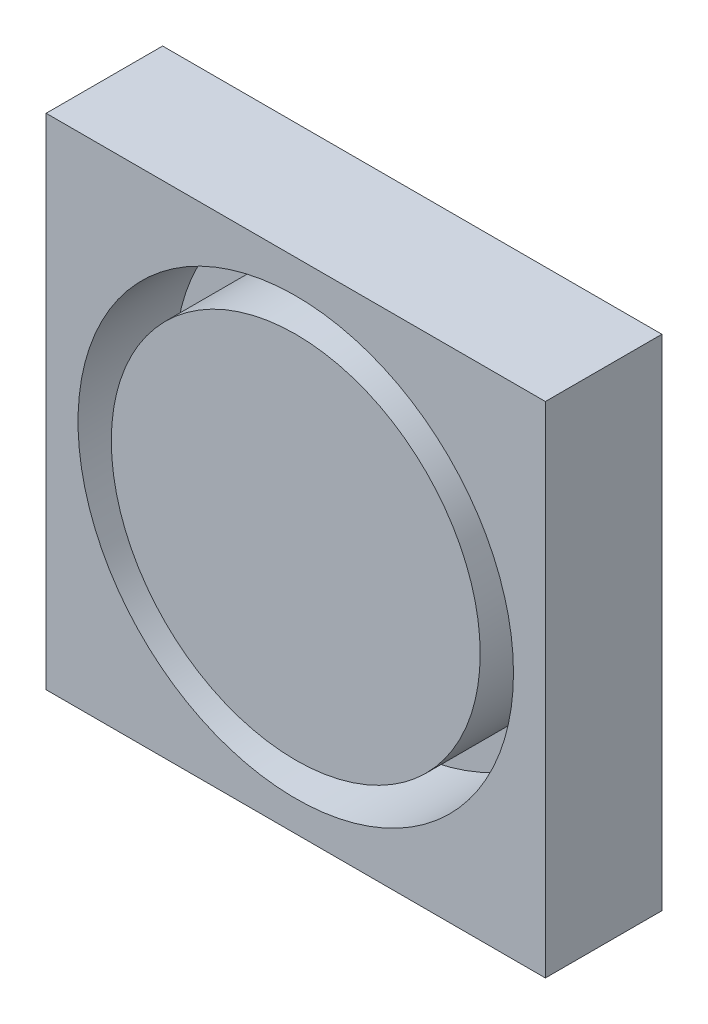
ISO-10303-21;
HEADER;
FILE_DESCRIPTION(('STEP AP214'),'2;1');
FILE_NAME('part.step','',(''),(''),'','','');
FILE_SCHEMA(('AUTOMOTIVE_DESIGN { 1 0 10303 214 1 1 1 1 }'));
ENDSEC;
DATA;
#1=APPLICATION_CONTEXT('core data for automotive mechanical design processes');
#2=APPLICATION_PROTOCOL_DEFINITION('international standard','automotive_design',2000,#1);
#3=PRODUCT_CONTEXT('',#1,'mechanical');
#4=PRODUCT('Part','Part','',(#3));
#5=PRODUCT_RELATED_PRODUCT_CATEGORY('part','',(#4));
#6=PRODUCT_DEFINITION_FORMATION('','',#4);
#7=PRODUCT_DEFINITION_CONTEXT('part definition',#1,'design');
#8=PRODUCT_DEFINITION('design','',#6,#7);
#9=PRODUCT_DEFINITION_SHAPE('','',#8);
#10=(LENGTH_UNIT() NAMED_UNIT(*) SI_UNIT(.MILLI.,.METRE.));
#11=(NAMED_UNIT(*) PLANE_ANGLE_UNIT() SI_UNIT($,.RADIAN.));
#12=(NAMED_UNIT(*) SI_UNIT($,.STERADIAN.) SOLID_ANGLE_UNIT());
#13=UNCERTAINTY_MEASURE_WITH_UNIT(LENGTH_MEASURE(1.E-05),#10,'distance_accuracy_value','');
#14=(GEOMETRIC_REPRESENTATION_CONTEXT(3) GLOBAL_UNCERTAINTY_ASSIGNED_CONTEXT((#13)) GLOBAL_UNIT_ASSIGNED_CONTEXT((#10,
#11,#12)) REPRESENTATION_CONTEXT('',''));
#15=CARTESIAN_POINT('',(0.,0.,0.));
#16=DIRECTION('',(0.,0.,1.));
#17=DIRECTION('',(1.,0.,0.));
#18=AXIS2_PLACEMENT_3D('',#15,#16,#17);
#19=CARTESIAN_POINT('',(0.,0.,7.));
#20=DIRECTION('',(1.,0.,0.));
#21=DIRECTION('',(0.,1.,0.));
#22=AXIS2_PLACEMENT_3D('',#19,#20,#21);
#23=PLANE('',#22);
#24=DIRECTION('',(0.,-1.,0.));
#25=VECTOR('',#24,1.);
#26=CARTESIAN_POINT('',(0.,0.,0.));
#27=LINE('',#26,#25);
#28=CARTESIAN_POINT('',(0.,0.,0.));
#29=VERTEX_POINT('',#28);
#30=CARTESIAN_POINT('',(0.,-30.,0.));
#31=VERTEX_POINT('',#30);
#32=EDGE_CURVE('E95',#29,#31,#27,.T.);
#33=ORIENTED_EDGE('',*,*,#32,.T.);
#34=DIRECTION('',(0.,0.,-1.));
#35=VECTOR('',#34,1.);
#36=CARTESIAN_POINT('',(0.,-30.,7.));
#37=LINE('',#36,#35);
#38=CARTESIAN_POINT('',(0.,-30.,7.));
#39=VERTEX_POINT('',#38);
#40=EDGE_CURVE('E11',#39,#31,#37,.T.);
#41=ORIENTED_EDGE('',*,*,#40,.F.);
#42=DIRECTION('',(0.,-1.,0.));
#43=VECTOR('',#42,1.);
#44=CARTESIAN_POINT('',(0.,0.,7.));
#45=LINE('',#44,#43);
#46=CARTESIAN_POINT('',(0.,0.,7.));
#47=VERTEX_POINT('',#46);
#48=EDGE_CURVE('E83',#47,#39,#45,.T.);
#49=ORIENTED_EDGE('',*,*,#48,.F.);
#50=DIRECTION('',(0.,0.,-1.));
#51=VECTOR('',#50,1.);
#52=CARTESIAN_POINT('',(0.,0.,7.));
#53=LINE('',#52,#51);
#54=EDGE_CURVE('E91',#47,#29,#53,.T.);
#55=ORIENTED_EDGE('',*,*,#54,.T.);
#56=EDGE_LOOP('',(#33,#41,#49,#55));
#57=FACE_BOUND('',#56,.T.);
#58=ADVANCED_FACE('F32',(#57),#23,.F.);
#59=CARTESIAN_POINT('',(0.,-30.,7.));
#60=DIRECTION('',(0.,1.,0.));
#61=DIRECTION('',(0.,0.,1.));
#62=AXIS2_PLACEMENT_3D('',#59,#60,#61);
#63=PLANE('',#62);
#64=DIRECTION('',(1.,0.,0.));
#65=VECTOR('',#64,1.);
#66=CARTESIAN_POINT('',(0.,-30.,0.));
#67=LINE('',#66,#65);
#68=CARTESIAN_POINT('',(30.,-30.,0.));
#69=VERTEX_POINT('',#68);
#70=EDGE_CURVE('E87',#31,#69,#67,.T.);
#71=ORIENTED_EDGE('',*,*,#70,.T.);
#72=DIRECTION('',(0.,0.,-1.));
#73=VECTOR('',#72,1.);
#74=CARTESIAN_POINT('',(30.,-30.,7.));
#75=LINE('',#74,#73);
#76=CARTESIAN_POINT('',(30.,-30.,7.));
#77=VERTEX_POINT('',#76);
#78=EDGE_CURVE('E40',#77,#69,#75,.T.);
#79=ORIENTED_EDGE('',*,*,#78,.F.);
#80=DIRECTION('',(1.,0.,0.));
#81=VECTOR('',#80,1.);
#82=CARTESIAN_POINT('',(0.,-30.,7.));
#83=LINE('',#82,#81);
#84=EDGE_CURVE('E78',#39,#77,#83,.T.);
#85=ORIENTED_EDGE('',*,*,#84,.F.);
#86=ORIENTED_EDGE('',*,*,#40,.T.);
#87=EDGE_LOOP('',(#71,#79,#85,#86));
#88=FACE_BOUND('',#87,.T.);
#89=ADVANCED_FACE('F86',(#88),#63,.F.);
#90=CARTESIAN_POINT('',(30.,0.,7.));
#91=DIRECTION('',(-1.,0.,0.));
#92=DIRECTION('',(0.,-1.,0.));
#93=AXIS2_PLACEMENT_3D('',#90,#91,#92);
#94=PLANE('',#93);
#95=DIRECTION('',(0.,1.,0.));
#96=VECTOR('',#95,1.);
#97=CARTESIAN_POINT('',(30.,0.,0.));
#98=LINE('',#97,#96);
#99=CARTESIAN_POINT('',(30.,0.,0.));
#100=VERTEX_POINT('',#99);
#101=EDGE_CURVE('E65',#69,#100,#98,.T.);
#102=ORIENTED_EDGE('',*,*,#101,.T.);
#103=DIRECTION('',(0.,0.,-1.));
#104=VECTOR('',#103,1.);
#105=CARTESIAN_POINT('',(30.,0.,7.));
#106=LINE('',#105,#104);
#107=CARTESIAN_POINT('',(30.,0.,7.));
#108=VERTEX_POINT('',#107);
#109=EDGE_CURVE('E88',#108,#100,#106,.T.);
#110=ORIENTED_EDGE('',*,*,#109,.F.);
#111=DIRECTION('',(0.,1.,0.));
#112=VECTOR('',#111,1.);
#113=CARTESIAN_POINT('',(30.,0.,7.));
#114=LINE('',#113,#112);
#115=EDGE_CURVE('E81',#77,#108,#114,.T.);
#116=ORIENTED_EDGE('',*,*,#115,.F.);
#117=ORIENTED_EDGE('',*,*,#78,.T.);
#118=EDGE_LOOP('',(#102,#110,#116,#117));
#119=FACE_BOUND('',#118,.T.);
#120=ADVANCED_FACE('F89',(#119),#94,.F.);
#121=CARTESIAN_POINT('',(0.,0.,7.));
#122=DIRECTION('',(0.,-1.,0.));
#123=DIRECTION('',(0.,0.,-1.));
#124=AXIS2_PLACEMENT_3D('',#121,#122,#123);
#125=PLANE('',#124);
#126=DIRECTION('',(-1.,0.,0.));
#127=VECTOR('',#126,1.);
#128=CARTESIAN_POINT('',(0.,0.,0.));
#129=LINE('',#128,#127);
#130=EDGE_CURVE('E71',#100,#29,#129,.T.);
#131=ORIENTED_EDGE('',*,*,#130,.T.);
#132=ORIENTED_EDGE('',*,*,#54,.F.);
#133=DIRECTION('',(-1.,0.,0.));
#134=VECTOR('',#133,1.);
#135=CARTESIAN_POINT('',(0.,0.,7.));
#136=LINE('',#135,#134);
#137=EDGE_CURVE('E48',#108,#47,#136,.T.);
#138=ORIENTED_EDGE('',*,*,#137,.F.);
#139=ORIENTED_EDGE('',*,*,#109,.T.);
#140=EDGE_LOOP('',(#131,#132,#138,#139));
#141=FACE_BOUND('',#140,.T.);
#142=ADVANCED_FACE('F103',(#141),#125,.F.);
#143=CARTESIAN_POINT('',(0.,0.,7.));
#144=DIRECTION('',(0.,0.,1.));
#145=DIRECTION('',(1.,0.,0.));
#146=AXIS2_PLACEMENT_3D('',#143,#144,#145);
#147=PLANE('',#146);
#148=CARTESIAN_POINT('',(15.,-15.083,7.));
#149=DIRECTION('',(0.,0.,1.));
#150=DIRECTION('',(1.,0.,0.));
#151=AXIS2_PLACEMENT_3D('',#148,#149,#150);
#152=CIRCLE('',#151,13.083);
#153=CARTESIAN_POINT('',(28.083,-15.083,7.));
#154=VERTEX_POINT('',#153);
#155=EDGE_CURVE('E109',#154,#154,#152,.T.);
#156=ORIENTED_EDGE('',*,*,#155,.F.);
#157=EDGE_LOOP('',(#156));
#158=FACE_BOUND('',#157,.T.);
#159=ORIENTED_EDGE('',*,*,#48,.T.);
#160=ORIENTED_EDGE('',*,*,#84,.T.);
#161=ORIENTED_EDGE('',*,*,#115,.T.);
#162=ORIENTED_EDGE('',*,*,#137,.T.);
#163=EDGE_LOOP('',(#159,#160,#161,#162));
#164=FACE_BOUND('',#163,.T.);
#165=ADVANCED_FACE('F79',(#158,#164),#147,.T.);
#166=CARTESIAN_POINT('',(0.,0.,0.));
#167=DIRECTION('',(0.,0.,1.));
#168=DIRECTION('',(1.,0.,0.));
#169=AXIS2_PLACEMENT_3D('',#166,#167,#168);
#170=PLANE('',#169);
#171=ORIENTED_EDGE('',*,*,#32,.F.);
#172=ORIENTED_EDGE('',*,*,#130,.F.);
#173=ORIENTED_EDGE('',*,*,#101,.F.);
#174=ORIENTED_EDGE('',*,*,#70,.F.);
#175=EDGE_LOOP('',(#171,#172,#173,#174));
#176=FACE_BOUND('',#175,.T.);
#177=ADVANCED_FACE('F106',(#176),#170,.F.);
#178=CARTESIAN_POINT('',(15.,-15.083,1.2));
#179=DIRECTION('',(0.,0.,1.));
#180=DIRECTION('',(1.,0.,0.));
#181=AXIS2_PLACEMENT_3D('',#178,#179,#180);
#182=CYLINDRICAL_SURFACE('',#181,13.083);
#183=CARTESIAN_POINT('',(15.,-15.083,1.2));
#184=DIRECTION('',(0.,0.,1.));
#185=DIRECTION('',(1.,0.,0.));
#186=AXIS2_PLACEMENT_3D('',#183,#184,#185);
#187=CIRCLE('',#186,13.083);
#188=CARTESIAN_POINT('',(28.083,-15.083,1.2));
#189=VERTEX_POINT('',#188);
#190=EDGE_CURVE('E98',#189,#189,#187,.T.);
#191=ORIENTED_EDGE('',*,*,#190,.F.);
#192=EDGE_LOOP('',(#191));
#193=FACE_BOUND('',#192,.T.);
#194=ORIENTED_EDGE('',*,*,#155,.T.);
#195=EDGE_LOOP('',(#194));
#196=FACE_BOUND('',#195,.T.);
#197=ADVANCED_FACE('F127',(#193,#196),#182,.F.);
#198=CARTESIAN_POINT('',(15.,-15.083,1.2));
#199=DIRECTION('',(0.,0.,1.));
#200=DIRECTION('',(1.,0.,0.));
#201=AXIS2_PLACEMENT_3D('',#198,#199,#200);
#202=PLANE('',#201);
#203=CARTESIAN_POINT('',(15.,-15.083,1.2));
#204=DIRECTION('',(0.,0.,1.));
#205=DIRECTION('',(1.,0.,0.));
#206=AXIS2_PLACEMENT_3D('',#203,#204,#205);
#207=CIRCLE('',#206,11.083);
#208=CARTESIAN_POINT('',(26.083,-15.083,1.2));
#209=VERTEX_POINT('',#208);
#210=EDGE_CURVE('E112',#209,#209,#207,.T.);
#211=ORIENTED_EDGE('',*,*,#210,.F.);
#212=EDGE_LOOP('',(#211));
#213=FACE_BOUND('',#212,.T.);
#214=ORIENTED_EDGE('',*,*,#190,.T.);
#215=EDGE_LOOP('',(#214));
#216=FACE_BOUND('',#215,.T.);
#217=ADVANCED_FACE('F124',(#213,#216),#202,.T.);
#218=CARTESIAN_POINT('',(15.,-15.083,1.2));
#219=DIRECTION('',(0.,0.,1.));
#220=DIRECTION('',(1.,0.,0.));
#221=AXIS2_PLACEMENT_3D('',#218,#219,#220);
#222=CYLINDRICAL_SURFACE('',#221,11.083);
#223=ORIENTED_EDGE('',*,*,#210,.T.);
#224=EDGE_LOOP('',(#223));
#225=FACE_BOUND('',#224,.T.);
#226=CARTESIAN_POINT('',(15.,-15.083,7.));
#227=DIRECTION('',(0.,0.,1.));
#228=DIRECTION('',(1.,0.,0.));
#229=AXIS2_PLACEMENT_3D('',#226,#227,#228);
#230=CIRCLE('',#229,11.083);
#231=CARTESIAN_POINT('',(26.083,-15.083,7.));
#232=VERTEX_POINT('',#231);
#233=EDGE_CURVE('E115',#232,#232,#230,.T.);
#234=ORIENTED_EDGE('',*,*,#233,.F.);
#235=EDGE_LOOP('',(#234));
#236=FACE_BOUND('',#235,.T.);
#237=ADVANCED_FACE('F121',(#225,#236),#222,.T.);
#238=ORIENTED_EDGE('',*,*,#233,.T.);
#239=EDGE_LOOP('',(#238));
#240=FACE_BOUND('',#239,.T.);
#241=ADVANCED_FACE('F138',(#240),#147,.T.);
#242=CLOSED_SHELL('',(#58,#89,#120,#142,#165,#177,#197,#217,#237,#241));
#243=MANIFOLD_SOLID_BREP('B2',#242);
#244=ADVANCED_BREP_SHAPE_REPRESENTATION('',(#18,#243),#14);
#245=SHAPE_DEFINITION_REPRESENTATION(#9,#244);
ENDSEC;
END-ISO-10303-21;
